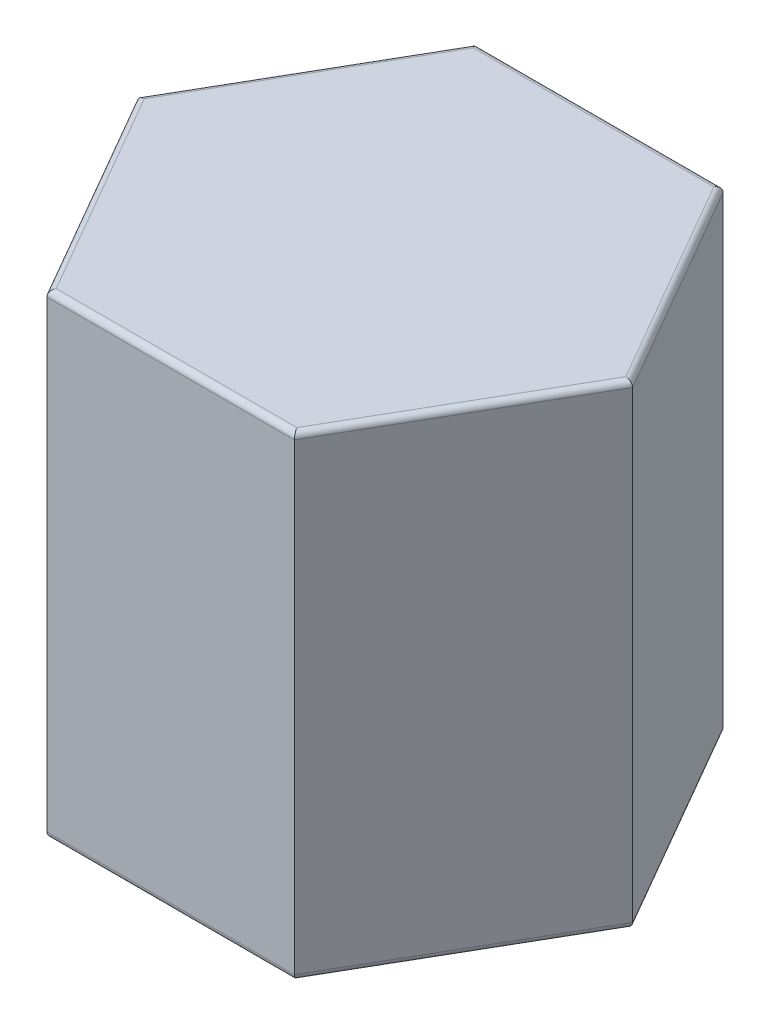
ISO-10303-21;
HEADER;
FILE_DESCRIPTION(('STEP AP214'),'2;1');
FILE_NAME('part.step','',(''),(''),'','','');
FILE_SCHEMA(('AUTOMOTIVE_DESIGN { 1 0 10303 214 1 1 1 1 }'));
ENDSEC;
DATA;
#1=APPLICATION_CONTEXT('core data for automotive mechanical design processes');
#2=APPLICATION_PROTOCOL_DEFINITION('international standard','automotive_design',2000,#1);
#3=PRODUCT_CONTEXT('',#1,'mechanical');
#4=PRODUCT('Part','Part','',(#3));
#5=PRODUCT_RELATED_PRODUCT_CATEGORY('part','',(#4));
#6=PRODUCT_DEFINITION_FORMATION('','',#4);
#7=PRODUCT_DEFINITION_CONTEXT('part definition',#1,'design');
#8=PRODUCT_DEFINITION('design','',#6,#7);
#9=PRODUCT_DEFINITION_SHAPE('','',#8);
#10=(LENGTH_UNIT() NAMED_UNIT(*) SI_UNIT(.MILLI.,.METRE.));
#11=(NAMED_UNIT(*) PLANE_ANGLE_UNIT() SI_UNIT($,.RADIAN.));
#12=(NAMED_UNIT(*) SI_UNIT($,.STERADIAN.) SOLID_ANGLE_UNIT());
#13=UNCERTAINTY_MEASURE_WITH_UNIT(LENGTH_MEASURE(1.E-05),#10,'distance_accuracy_value','');
#14=(GEOMETRIC_REPRESENTATION_CONTEXT(3) GLOBAL_UNCERTAINTY_ASSIGNED_CONTEXT((#13)) GLOBAL_UNIT_ASSIGNED_CONTEXT((#10,
#11,#12)) REPRESENTATION_CONTEXT('',''));
#15=CARTESIAN_POINT('',(0.,0.,0.));
#16=DIRECTION('',(0.,0.,1.));
#17=DIRECTION('',(1.,0.,0.));
#18=AXIS2_PLACEMENT_3D('',#15,#16,#17);
#19=CARTESIAN_POINT('',(20.846252377345,40.,0.00164959713498398));
#20=DIRECTION('',(-0.866025403784439,0.,-0.499999999999999));
#21=DIRECTION('',(-0.499999999999999,0.,0.866025403784439));
#22=AXIS2_PLACEMENT_3D('',#19,#20,#21);
#23=PLANE('',#22);
#24=DIRECTION('',(0.,-1.,0.));
#25=VECTOR('',#24,1.);
#26=CARTESIAN_POINT('',(10.4236026465347,40.,18.0542084803927));
#27=LINE('',#26,#25);
#28=CARTESIAN_POINT('',(10.4236026465347,39.5,18.0542084803927));
#29=VERTEX_POINT('',#28);
#30=CARTESIAN_POINT('',(10.4236026465347,0.5,18.0542084803927));
#31=VERTEX_POINT('',#30);
#32=EDGE_CURVE('E204',#29,#31,#27,.T.);
#33=ORIENTED_EDGE('',*,*,#32,.T.);
#34=DIRECTION('',(0.499999999999999,0.,-0.866025403784439));
#35=VECTOR('',#34,1.);
#36=CARTESIAN_POINT('',(20.846252377345,0.5,0.00164959713498414));
#37=LINE('',#36,#35);
#38=CARTESIAN_POINT('',(20.846252377345,0.5,0.00164959713498398));
#39=VERTEX_POINT('',#38);
#40=EDGE_CURVE('E154',#31,#39,#37,.T.);
#41=ORIENTED_EDGE('',*,*,#40,.T.);
#42=DIRECTION('',(0.,-1.,0.));
#43=VECTOR('',#42,1.);
#44=CARTESIAN_POINT('',(20.846252377345,40.,0.00164959713498398));
#45=LINE('',#44,#43);
#46=CARTESIAN_POINT('',(20.846252377345,39.5,0.00164959713498398));
#47=VERTEX_POINT('',#46);
#48=EDGE_CURVE('E138',#47,#39,#45,.T.);
#49=ORIENTED_EDGE('',*,*,#48,.F.);
#50=DIRECTION('',(0.499999999999999,0.,-0.866025403784439));
#51=VECTOR('',#50,1.);
#52=CARTESIAN_POINT('',(20.846252377345,39.5,0.00164959713498398));
#53=LINE('',#52,#51);
#54=EDGE_CURVE('E151',#47,#29,#53,.F.);
#55=ORIENTED_EDGE('',*,*,#54,.T.);
#56=EDGE_LOOP('',(#33,#41,#49,#55));
#57=FACE_BOUND('',#56,.T.);
#58=ADVANCED_FACE('F43',(#57),#23,.F.);
#59=CARTESIAN_POINT('',(10.4236026465346,40.,-18.0509092861226));
#60=DIRECTION('',(-0.866025403784438,0.,0.500000000000001));
#61=DIRECTION('',(0.500000000000001,0.,0.866025403784438));
#62=AXIS2_PLACEMENT_3D('',#59,#60,#61);
#63=PLANE('',#62);
#64=ORIENTED_EDGE('',*,*,#48,.T.);
#65=DIRECTION('',(-0.500000000000001,0.,-0.866025403784438));
#66=VECTOR('',#65,1.);
#67=CARTESIAN_POINT('',(10.4236026465346,0.5,-18.0509092861226));
#68=LINE('',#67,#66);
#69=CARTESIAN_POINT('',(10.4236026465346,0.5,-18.0509092861226));
#70=VERTEX_POINT('',#69);
#71=EDGE_CURVE('E144',#39,#70,#68,.T.);
#72=ORIENTED_EDGE('',*,*,#71,.T.);
#73=DIRECTION('',(0.,-1.,0.));
#74=VECTOR('',#73,1.);
#75=CARTESIAN_POINT('',(10.4236026465346,40.,-18.0509092861226));
#76=LINE('',#75,#74);
#77=CARTESIAN_POINT('',(10.4236026465346,39.5,-18.0509092861226));
#78=VERTEX_POINT('',#77);
#79=EDGE_CURVE('E140',#78,#70,#76,.T.);
#80=ORIENTED_EDGE('',*,*,#79,.F.);
#81=DIRECTION('',(-0.500000000000001,0.,-0.866025403784438));
#82=VECTOR('',#81,1.);
#83=CARTESIAN_POINT('',(10.4236026465346,39.5,-18.0509092861226));
#84=LINE('',#83,#82);
#85=EDGE_CURVE('E135',#78,#47,#84,.F.);
#86=ORIENTED_EDGE('',*,*,#85,.T.);
#87=EDGE_LOOP('',(#64,#72,#80,#86));
#88=FACE_BOUND('',#87,.T.);
#89=ADVANCED_FACE('F137',(#88),#63,.F.);
#90=CARTESIAN_POINT('',(-10.4216968150861,40.,-18.0509092861226));
#91=DIRECTION('',(0.,0.,1.));
#92=DIRECTION('',(1.,0.,0.));
#93=AXIS2_PLACEMENT_3D('',#90,#91,#92);
#94=PLANE('',#93);
#95=ORIENTED_EDGE('',*,*,#79,.T.);
#96=DIRECTION('',(-1.,0.,0.));
#97=VECTOR('',#96,1.);
#98=CARTESIAN_POINT('',(-10.4216968150861,0.5,-18.0509092861226));
#99=LINE('',#98,#97);
#100=CARTESIAN_POINT('',(-10.4216968150861,0.5,-18.0509092861226));
#101=VERTEX_POINT('',#100);
#102=EDGE_CURVE('E238',#70,#101,#99,.T.);
#103=ORIENTED_EDGE('',*,*,#102,.T.);
#104=DIRECTION('',(0.,-1.,0.));
#105=VECTOR('',#104,1.);
#106=CARTESIAN_POINT('',(-10.4216968150861,40.,-18.0509092861226));
#107=LINE('',#106,#105);
#108=CARTESIAN_POINT('',(-10.4216968150861,39.5,-18.0509092861226));
#109=VERTEX_POINT('',#108);
#110=EDGE_CURVE('E218',#109,#101,#107,.T.);
#111=ORIENTED_EDGE('',*,*,#110,.F.);
#112=DIRECTION('',(-1.,0.,0.));
#113=VECTOR('',#112,1.);
#114=CARTESIAN_POINT('',(-10.4216968150861,39.5,-18.0509092861226));
#115=LINE('',#114,#113);
#116=EDGE_CURVE('E236',#109,#78,#115,.F.);
#117=ORIENTED_EDGE('',*,*,#116,.T.);
#118=EDGE_LOOP('',(#95,#103,#111,#117));
#119=FACE_BOUND('',#118,.T.);
#120=ADVANCED_FACE('F295',(#119),#94,.F.);
#121=CARTESIAN_POINT('',(-20.8443465458965,40.,0.00164959713510541));
#122=DIRECTION('',(0.866025403784439,0.,0.499999999999998));
#123=DIRECTION('',(0.499999999999999,0.,-0.86602540378444));
#124=AXIS2_PLACEMENT_3D('',#121,#122,#123);
#125=PLANE('',#124);
#126=ORIENTED_EDGE('',*,*,#110,.T.);
#127=DIRECTION('',(-0.499999999999999,0.,0.86602540378444));
#128=VECTOR('',#127,1.);
#129=CARTESIAN_POINT('',(-20.8443465458965,0.5,0.00164959713510529));
#130=LINE('',#129,#128);
#131=CARTESIAN_POINT('',(-20.8443465458965,0.5,0.00164959713510541));
#132=VERTEX_POINT('',#131);
#133=EDGE_CURVE('E242',#101,#132,#130,.T.);
#134=ORIENTED_EDGE('',*,*,#133,.T.);
#135=DIRECTION('',(0.,-1.,0.));
#136=VECTOR('',#135,1.);
#137=CARTESIAN_POINT('',(-20.8443465458965,40.,0.00164959713510541));
#138=LINE('',#137,#136);
#139=CARTESIAN_POINT('',(-20.8443465458965,39.5,0.00164959713510541));
#140=VERTEX_POINT('',#139);
#141=EDGE_CURVE('E213',#140,#132,#138,.T.);
#142=ORIENTED_EDGE('',*,*,#141,.F.);
#143=DIRECTION('',(-0.499999999999999,0.,0.86602540378444));
#144=VECTOR('',#143,1.);
#145=CARTESIAN_POINT('',(-20.8443465458965,39.5,0.00164959713510541));
#146=LINE('',#145,#144);
#147=EDGE_CURVE('E240',#140,#109,#146,.F.);
#148=ORIENTED_EDGE('',*,*,#147,.T.);
#149=EDGE_LOOP('',(#126,#134,#142,#148));
#150=FACE_BOUND('',#149,.T.);
#151=ADVANCED_FACE('F300',(#150),#125,.F.);
#152=CARTESIAN_POINT('',(-10.4216968150861,40.,18.0542084803927));
#153=DIRECTION('',(0.866025403784438,0.,-0.500000000000002));
#154=DIRECTION('',(-0.500000000000002,0.,-0.866025403784438));
#155=AXIS2_PLACEMENT_3D('',#152,#153,#154);
#156=PLANE('',#155);
#157=ORIENTED_EDGE('',*,*,#141,.T.);
#158=DIRECTION('',(0.500000000000002,0.,0.866025403784438));
#159=VECTOR('',#158,1.);
#160=CARTESIAN_POINT('',(-10.4216968150861,0.5,18.0542084803927));
#161=LINE('',#160,#159);
#162=CARTESIAN_POINT('',(-10.4216968150861,0.5,18.0542084803927));
#163=VERTEX_POINT('',#162);
#164=EDGE_CURVE('E246',#132,#163,#161,.T.);
#165=ORIENTED_EDGE('',*,*,#164,.T.);
#166=DIRECTION('',(0.,-1.,0.));
#167=VECTOR('',#166,1.);
#168=CARTESIAN_POINT('',(-10.4216968150861,40.,18.0542084803927));
#169=LINE('',#168,#167);
#170=CARTESIAN_POINT('',(-10.4216968150861,39.5,18.0542084803927));
#171=VERTEX_POINT('',#170);
#172=EDGE_CURVE('E209',#171,#163,#169,.T.);
#173=ORIENTED_EDGE('',*,*,#172,.F.);
#174=DIRECTION('',(0.500000000000002,0.,0.866025403784438));
#175=VECTOR('',#174,1.);
#176=CARTESIAN_POINT('',(-10.4216968150861,39.5,18.0542084803927));
#177=LINE('',#176,#175);
#178=EDGE_CURVE('E244',#171,#140,#177,.F.);
#179=ORIENTED_EDGE('',*,*,#178,.T.);
#180=EDGE_LOOP('',(#157,#165,#173,#179));
#181=FACE_BOUND('',#180,.T.);
#182=ADVANCED_FACE('F273',(#181),#156,.F.);
#183=CARTESIAN_POINT('',(10.4236026465347,40.,18.0542084803927));
#184=DIRECTION('',(0.,0.,-1.));
#185=DIRECTION('',(-1.,0.,0.));
#186=AXIS2_PLACEMENT_3D('',#183,#184,#185);
#187=PLANE('',#186);
#188=ORIENTED_EDGE('',*,*,#172,.T.);
#189=DIRECTION('',(1.,0.,0.));
#190=VECTOR('',#189,1.);
#191=CARTESIAN_POINT('',(10.4236026465347,0.5,18.0542084803927));
#192=LINE('',#191,#190);
#193=EDGE_CURVE('E250',#163,#31,#192,.T.);
#194=ORIENTED_EDGE('',*,*,#193,.T.);
#195=ORIENTED_EDGE('',*,*,#32,.F.);
#196=DIRECTION('',(1.,0.,0.));
#197=VECTOR('',#196,1.);
#198=CARTESIAN_POINT('',(10.4236026465347,39.5,18.0542084803927));
#199=LINE('',#198,#197);
#200=EDGE_CURVE('E248',#29,#171,#199,.F.);
#201=ORIENTED_EDGE('',*,*,#200,.T.);
#202=EDGE_LOOP('',(#188,#194,#195,#201));
#203=FACE_BOUND('',#202,.T.);
#204=ADVANCED_FACE('F270',(#203),#187,.F.);
#205=CARTESIAN_POINT('',(0.,40.,0.));
#206=DIRECTION('',(0.,-1.,0.));
#207=DIRECTION('',(0.,0.,-1.));
#208=AXIS2_PLACEMENT_3D('',#205,#206,#207);
#209=PLANE('',#208);
#210=DIRECTION('',(1.,0.,0.));
#211=VECTOR('',#210,1.);
#212=CARTESIAN_POINT('',(0.,40.,17.5542084803927));
#213=LINE('',#212,#211);
#214=CARTESIAN_POINT('',(-10.1330216804913,40.,17.5542084803927));
#215=VERTEX_POINT('',#214);
#216=CARTESIAN_POINT('',(10.1349275119399,40.,17.5542084803927));
#217=VERTEX_POINT('',#216);
#218=EDGE_CURVE('E252',#215,#217,#213,.T.);
#219=ORIENTED_EDGE('',*,*,#218,.T.);
#220=DIRECTION('',(0.499999999999999,0.,-0.866025403784439));
#221=VECTOR('',#220,1.);
#222=CARTESIAN_POINT('',(15.202390877629,40.,8.777104465525));
#223=LINE('',#222,#221);
#224=CARTESIAN_POINT('',(20.2689021081554,40.,0.00164959713497996));
#225=VERTEX_POINT('',#224);
#226=EDGE_CURVE('E11',#217,#225,#223,.T.);
#227=ORIENTED_EDGE('',*,*,#226,.T.);
#228=DIRECTION('',(-0.500000000000001,0.,-0.866025403784438));
#229=VECTOR('',#228,1.);
#230=CARTESIAN_POINT('',(15.2009622846041,40.,-8.77627966695755));
#231=LINE('',#230,#229);
#232=CARTESIAN_POINT('',(10.1349275119398,40.,-17.5509092861226));
#233=VERTEX_POINT('',#232);
#234=EDGE_CURVE('E52',#225,#233,#231,.T.);
#235=ORIENTED_EDGE('',*,*,#234,.T.);
#236=DIRECTION('',(-1.,0.,0.));
#237=VECTOR('',#236,1.);
#238=CARTESIAN_POINT('',(0.,40.,-17.5509092861226));
#239=LINE('',#238,#237);
#240=CARTESIAN_POINT('',(-10.1330216804913,40.,-17.5509092861226));
#241=VERTEX_POINT('',#240);
#242=EDGE_CURVE('E258',#233,#241,#239,.T.);
#243=ORIENTED_EDGE('',*,*,#242,.T.);
#244=DIRECTION('',(-0.499999999999999,0.,0.86602540378444));
#245=VECTOR('',#244,1.);
#246=CARTESIAN_POINT('',(-15.1995329110177,40.,-8.77545441773258));
#247=LINE('',#246,#245);
#248=CARTESIAN_POINT('',(-20.2669962767068,40.,0.0016495971351095));
#249=VERTEX_POINT('',#248);
#250=EDGE_CURVE('E256',#241,#249,#247,.T.);
#251=ORIENTED_EDGE('',*,*,#250,.T.);
#252=DIRECTION('',(0.500000000000002,0.,0.866025403784438));
#253=VECTOR('',#252,1.);
#254=CARTESIAN_POINT('',(-15.2009615040426,40.,8.77627921630017));
#255=LINE('',#254,#253);
#256=EDGE_CURVE('E254',#249,#215,#255,.T.);
#257=ORIENTED_EDGE('',*,*,#256,.T.);
#258=EDGE_LOOP('',(#219,#227,#235,#243,#251,#257));
#259=FACE_BOUND('',#258,.T.);
#260=ADVANCED_FACE('F260',(#259),#209,.F.);
#261=CARTESIAN_POINT('',(0.,0.,0.));
#262=DIRECTION('',(0.,-1.,0.));
#263=DIRECTION('',(0.,0.,-1.));
#264=AXIS2_PLACEMENT_3D('',#261,#262,#263);
#265=PLANE('',#264);
#266=DIRECTION('',(-0.500000000000001,0.,-0.866025403784438));
#267=VECTOR('',#266,1.);
#268=CARTESIAN_POINT('',(20.4132396754528,0.,0.251649597134983));
#269=LINE('',#268,#267);
#270=CARTESIAN_POINT('',(10.1349275119398,0.,-17.5509092861226));
#271=VERTEX_POINT('',#270);
#272=CARTESIAN_POINT('',(20.2689021081554,0.,0.00164959713498256));
#273=VERTEX_POINT('',#272);
#274=EDGE_CURVE('E231',#271,#273,#269,.F.);
#275=ORIENTED_EDGE('',*,*,#274,.T.);
#276=DIRECTION('',(0.499999999999999,0.,-0.866025403784439));
#277=VECTOR('',#276,1.);
#278=CARTESIAN_POINT('',(9.99058994464245,0.,17.8042084803927));
#279=LINE('',#278,#277);
#280=CARTESIAN_POINT('',(10.1349275119399,0.,17.5542084803927));
#281=VERTEX_POINT('',#280);
#282=EDGE_CURVE('E145',#273,#281,#279,.F.);
#283=ORIENTED_EDGE('',*,*,#282,.T.);
#284=DIRECTION('',(1.,0.,0.));
#285=VECTOR('',#284,1.);
#286=CARTESIAN_POINT('',(-10.4216968150861,0.,17.5542084803927));
#287=LINE('',#286,#285);
#288=CARTESIAN_POINT('',(-10.1330216804913,0.,17.5542084803927));
#289=VERTEX_POINT('',#288);
#290=EDGE_CURVE('E223',#281,#289,#287,.F.);
#291=ORIENTED_EDGE('',*,*,#290,.T.);
#292=DIRECTION('',(0.500000000000002,0.,0.866025403784438));
#293=VECTOR('',#292,1.);
#294=CARTESIAN_POINT('',(-20.4113338440043,0.,-0.248350402864899));
#295=LINE('',#294,#293);
#296=CARTESIAN_POINT('',(-20.2669962767068,0.,0.00164959713510365));
#297=VERTEX_POINT('',#296);
#298=EDGE_CURVE('E225',#289,#297,#295,.F.);
#299=ORIENTED_EDGE('',*,*,#298,.T.);
#300=DIRECTION('',(-0.499999999999999,0.,0.86602540378444));
#301=VECTOR('',#300,1.);
#302=CARTESIAN_POINT('',(-9.98868411319389,0.,-17.8009092861226));
#303=LINE('',#302,#301);
#304=CARTESIAN_POINT('',(-10.1330216804913,0.,-17.5509092861226));
#305=VERTEX_POINT('',#304);
#306=EDGE_CURVE('E227',#297,#305,#303,.F.);
#307=ORIENTED_EDGE('',*,*,#306,.T.);
#308=DIRECTION('',(-1.,0.,0.));
#309=VECTOR('',#308,1.);
#310=CARTESIAN_POINT('',(10.4236026465346,0.,-17.5509092861226));
#311=LINE('',#310,#309);
#312=EDGE_CURVE('E229',#305,#271,#311,.F.);
#313=ORIENTED_EDGE('',*,*,#312,.T.);
#314=EDGE_LOOP('',(#275,#283,#291,#299,#307,#313));
#315=FACE_BOUND('',#314,.T.);
#316=ADVANCED_FACE('F309',(#315),#265,.T.);
#317=CARTESIAN_POINT('',(-20.4113338440042,0.5,0.251649597135105));
#318=DIRECTION('',(0.499999999999999,0.,-0.86602540378444));
#319=DIRECTION('',(-0.866025403784439,0.,-0.499999999999998));
#320=AXIS2_PLACEMENT_3D('',#317,#318,#319);
#321=CYLINDRICAL_SURFACE('',#320,0.5);
#322=CARTESIAN_POINT('',(-10.1330216804913,0.5,-17.5509092861226));
#323=DIRECTION('',(0.866025403784438,0.,-0.500000000000002));
#324=DIRECTION('',(-0.500000000000002,0.,-0.866025403784438));
#325=AXIS2_PLACEMENT_3D('',#322,#323,#324);
#326=ELLIPSE('',#325,0.577350269189626,0.5);
#327=EDGE_CURVE('E197',#305,#101,#326,.T.);
#328=ORIENTED_EDGE('',*,*,#327,.F.);
#329=ORIENTED_EDGE('',*,*,#306,.F.);
#330=CARTESIAN_POINT('',(-20.2669962767068,0.5,0.0016495971351094));
#331=DIRECTION('',(0.,0.,-1.));
#332=DIRECTION('',(-1.,0.,0.));
#333=AXIS2_PLACEMENT_3D('',#330,#331,#332);
#334=ELLIPSE('',#333,0.577350269189626,0.5);
#335=EDGE_CURVE('E166',#132,#297,#334,.F.);
#336=ORIENTED_EDGE('',*,*,#335,.F.);
#337=ORIENTED_EDGE('',*,*,#133,.F.);
#338=EDGE_LOOP('',(#328,#329,#336,#337));
#339=FACE_BOUND('',#338,.T.);
#340=ADVANCED_FACE('F312',(#339),#321,.T.);
#341=CARTESIAN_POINT('',(-9.98868411319385,0.5,17.8042084803927));
#342=DIRECTION('',(-0.500000000000002,0.,-0.866025403784438));
#343=DIRECTION('',(-0.866025403784438,0.,0.500000000000002));
#344=AXIS2_PLACEMENT_3D('',#341,#342,#343);
#345=CYLINDRICAL_SURFACE('',#344,0.5);
#346=ORIENTED_EDGE('',*,*,#335,.T.);
#347=ORIENTED_EDGE('',*,*,#298,.F.);
#348=CARTESIAN_POINT('',(-10.1330216804913,0.5,17.5542084803927));
#349=DIRECTION('',(-0.866025403784439,0.,-0.499999999999999));
#350=DIRECTION('',(-0.499999999999999,0.,0.86602540378444));
#351=AXIS2_PLACEMENT_3D('',#348,#349,#350);
#352=ELLIPSE('',#351,0.577350269189626,0.5);
#353=EDGE_CURVE('E195',#163,#289,#352,.F.);
#354=ORIENTED_EDGE('',*,*,#353,.F.);
#355=ORIENTED_EDGE('',*,*,#164,.F.);
#356=EDGE_LOOP('',(#346,#347,#354,#355));
#357=FACE_BOUND('',#356,.T.);
#358=ADVANCED_FACE('F275',(#357),#345,.T.);
#359=CARTESIAN_POINT('',(-10.4216968150861,0.5,-17.5509092861226));
#360=DIRECTION('',(1.,0.,0.));
#361=DIRECTION('',(0.,0.,-1.));
#362=AXIS2_PLACEMENT_3D('',#359,#360,#361);
#363=CYLINDRICAL_SURFACE('',#362,0.5);
#364=ORIENTED_EDGE('',*,*,#327,.T.);
#365=ORIENTED_EDGE('',*,*,#102,.F.);
#366=CARTESIAN_POINT('',(10.1349275119398,0.5,-17.5509092861226));
#367=DIRECTION('',(0.866025403784439,0.,0.499999999999998));
#368=DIRECTION('',(0.499999999999998,0.,-0.86602540378444));
#369=AXIS2_PLACEMENT_3D('',#366,#367,#368);
#370=ELLIPSE('',#369,0.577350269189626,0.5);
#371=EDGE_CURVE('E189',#271,#70,#370,.T.);
#372=ORIENTED_EDGE('',*,*,#371,.F.);
#373=ORIENTED_EDGE('',*,*,#312,.F.);
#374=EDGE_LOOP('',(#364,#365,#372,#373));
#375=FACE_BOUND('',#374,.T.);
#376=ADVANCED_FACE('F339',(#375),#363,.T.);
#377=CARTESIAN_POINT('',(10.4236026465347,0.5,17.5542084803927));
#378=DIRECTION('',(-1.,0.,0.));
#379=DIRECTION('',(0.,0.,1.));
#380=AXIS2_PLACEMENT_3D('',#377,#378,#379);
#381=CYLINDRICAL_SURFACE('',#380,0.5);
#382=ORIENTED_EDGE('',*,*,#353,.T.);
#383=ORIENTED_EDGE('',*,*,#290,.F.);
#384=CARTESIAN_POINT('',(10.1349275119399,0.5,17.5542084803927));
#385=DIRECTION('',(-0.866025403784438,0.,0.500000000000001));
#386=DIRECTION('',(-0.500000000000001,0.,-0.866025403784438));
#387=AXIS2_PLACEMENT_3D('',#384,#385,#386);
#388=ELLIPSE('',#387,0.577350269189626,0.5);
#389=EDGE_CURVE('E183',#31,#281,#388,.F.);
#390=ORIENTED_EDGE('',*,*,#389,.F.);
#391=ORIENTED_EDGE('',*,*,#193,.F.);
#392=EDGE_LOOP('',(#382,#383,#390,#391));
#393=FACE_BOUND('',#392,.T.);
#394=ADVANCED_FACE('F279',(#393),#381,.T.);
#395=CARTESIAN_POINT('',(9.99058994464243,0.5,-17.8009092861226));
#396=DIRECTION('',(0.500000000000001,0.,0.866025403784438));
#397=DIRECTION('',(0.866025403784438,0.,-0.500000000000001));
#398=AXIS2_PLACEMENT_3D('',#395,#396,#397);
#399=CYLINDRICAL_SURFACE('',#398,0.5);
#400=ORIENTED_EDGE('',*,*,#371,.T.);
#401=ORIENTED_EDGE('',*,*,#71,.F.);
#402=CARTESIAN_POINT('',(20.2689021081554,0.5,0.00164959713498013));
#403=DIRECTION('',(0.,0.,1.));
#404=DIRECTION('',(1.,0.,0.));
#405=AXIS2_PLACEMENT_3D('',#402,#403,#404);
#406=ELLIPSE('',#405,0.577350269189626,0.5);
#407=EDGE_CURVE('E178',#273,#39,#406,.T.);
#408=ORIENTED_EDGE('',*,*,#407,.F.);
#409=ORIENTED_EDGE('',*,*,#274,.F.);
#410=EDGE_LOOP('',(#400,#401,#408,#409));
#411=FACE_BOUND('',#410,.T.);
#412=ADVANCED_FACE('F282',(#411),#399,.T.);
#413=CARTESIAN_POINT('',(20.4132396754528,0.5,-0.248350402865015));
#414=DIRECTION('',(-0.499999999999999,0.,0.866025403784439));
#415=DIRECTION('',(0.866025403784439,0.,0.499999999999999));
#416=AXIS2_PLACEMENT_3D('',#413,#414,#415);
#417=CYLINDRICAL_SURFACE('',#416,0.5);
#418=ORIENTED_EDGE('',*,*,#389,.T.);
#419=ORIENTED_EDGE('',*,*,#282,.F.);
#420=ORIENTED_EDGE('',*,*,#407,.T.);
#421=ORIENTED_EDGE('',*,*,#40,.F.);
#422=EDGE_LOOP('',(#418,#419,#420,#421));
#423=FACE_BOUND('',#422,.T.);
#424=ADVANCED_FACE('F280',(#423),#417,.T.);
#425=CARTESIAN_POINT('',(-15.1995329110177,39.5,-8.77545441773258));
#426=DIRECTION('',(-0.499999999999999,0.,0.86602540378444));
#427=DIRECTION('',(0.866025403784439,0.,0.499999999999998));
#428=AXIS2_PLACEMENT_3D('',#425,#426,#427);
#429=CYLINDRICAL_SURFACE('',#428,0.5);
#430=CARTESIAN_POINT('',(-10.1330216804913,39.5,-17.5509092861226));
#431=DIRECTION('',(-0.866025403784438,0.,0.500000000000002));
#432=DIRECTION('',(0.500000000000002,0.,0.866025403784438));
#433=AXIS2_PLACEMENT_3D('',#430,#431,#432);
#434=ELLIPSE('',#433,0.577350269189626,0.5);
#435=EDGE_CURVE('E172',#109,#241,#434,.F.);
#436=ORIENTED_EDGE('',*,*,#435,.F.);
#437=ORIENTED_EDGE('',*,*,#147,.F.);
#438=CARTESIAN_POINT('',(-20.2669962767068,39.5,0.00164959713511766));
#439=DIRECTION('',(0.,0.,1.));
#440=DIRECTION('',(1.,0.,0.));
#441=AXIS2_PLACEMENT_3D('',#438,#439,#440);
#442=ELLIPSE('',#441,0.577350269189626,0.5);
#443=EDGE_CURVE('E47',#249,#140,#442,.T.);
#444=ORIENTED_EDGE('',*,*,#443,.F.);
#445=ORIENTED_EDGE('',*,*,#250,.F.);
#446=EDGE_LOOP('',(#436,#437,#444,#445));
#447=FACE_BOUND('',#446,.T.);
#448=ADVANCED_FACE('F45',(#447),#429,.T.);
#449=CARTESIAN_POINT('',(-15.2009615040426,39.5,8.77627921630017));
#450=DIRECTION('',(0.500000000000002,0.,0.866025403784438));
#451=DIRECTION('',(0.866025403784438,0.,-0.500000000000002));
#452=AXIS2_PLACEMENT_3D('',#449,#450,#451);
#453=CYLINDRICAL_SURFACE('',#452,0.5);
#454=ORIENTED_EDGE('',*,*,#443,.T.);
#455=ORIENTED_EDGE('',*,*,#178,.F.);
#456=CARTESIAN_POINT('',(-10.1330216804913,39.5,17.5542084803927));
#457=DIRECTION('',(0.866025403784439,0.,0.499999999999999));
#458=DIRECTION('',(0.499999999999999,0.,-0.86602540378444));
#459=AXIS2_PLACEMENT_3D('',#456,#457,#458);
#460=ELLIPSE('',#459,0.577350269189626,0.5);
#461=EDGE_CURVE('E170',#215,#171,#460,.T.);
#462=ORIENTED_EDGE('',*,*,#461,.F.);
#463=ORIENTED_EDGE('',*,*,#256,.F.);
#464=EDGE_LOOP('',(#454,#455,#462,#463));
#465=FACE_BOUND('',#464,.T.);
#466=ADVANCED_FACE('F264',(#465),#453,.T.);
#467=CARTESIAN_POINT('',(0.,39.5,-17.5509092861226));
#468=DIRECTION('',(-1.,0.,0.));
#469=DIRECTION('',(0.,0.,1.));
#470=AXIS2_PLACEMENT_3D('',#467,#468,#469);
#471=CYLINDRICAL_SURFACE('',#470,0.5);
#472=ORIENTED_EDGE('',*,*,#435,.T.);
#473=ORIENTED_EDGE('',*,*,#242,.F.);
#474=CARTESIAN_POINT('',(10.1349275119398,39.5,-17.5509092861226));
#475=DIRECTION('',(-0.866025403784439,0.,-0.499999999999998));
#476=DIRECTION('',(-0.499999999999998,0.,0.86602540378444));
#477=AXIS2_PLACEMENT_3D('',#474,#475,#476);
#478=ELLIPSE('',#477,0.577350269189626,0.5);
#479=EDGE_CURVE('E163',#78,#233,#478,.F.);
#480=ORIENTED_EDGE('',*,*,#479,.F.);
#481=ORIENTED_EDGE('',*,*,#116,.F.);
#482=EDGE_LOOP('',(#472,#473,#480,#481));
#483=FACE_BOUND('',#482,.T.);
#484=ADVANCED_FACE('F379',(#483),#471,.T.);
#485=CARTESIAN_POINT('',(0.,39.5,17.5542084803927));
#486=DIRECTION('',(1.,0.,0.));
#487=DIRECTION('',(0.,0.,-1.));
#488=AXIS2_PLACEMENT_3D('',#485,#486,#487);
#489=CYLINDRICAL_SURFACE('',#488,0.5);
#490=ORIENTED_EDGE('',*,*,#461,.T.);
#491=ORIENTED_EDGE('',*,*,#200,.F.);
#492=CARTESIAN_POINT('',(10.1349275119399,39.5,17.5542084803927));
#493=DIRECTION('',(0.866025403784438,0.,-0.500000000000001));
#494=DIRECTION('',(0.500000000000001,0.,0.866025403784438));
#495=AXIS2_PLACEMENT_3D('',#492,#493,#494);
#496=ELLIPSE('',#495,0.577350269189626,0.5);
#497=EDGE_CURVE('E158',#217,#29,#496,.T.);
#498=ORIENTED_EDGE('',*,*,#497,.F.);
#499=ORIENTED_EDGE('',*,*,#218,.F.);
#500=EDGE_LOOP('',(#490,#491,#498,#499));
#501=FACE_BOUND('',#500,.T.);
#502=ADVANCED_FACE('F267',(#501),#489,.T.);
#503=CARTESIAN_POINT('',(15.2009622846041,39.5,-8.77627966695754));
#504=DIRECTION('',(-0.500000000000001,0.,-0.866025403784438));
#505=DIRECTION('',(-0.866025403784438,0.,0.500000000000001));
#506=AXIS2_PLACEMENT_3D('',#503,#504,#505);
#507=CYLINDRICAL_SURFACE('',#506,0.5);
#508=ORIENTED_EDGE('',*,*,#479,.T.);
#509=ORIENTED_EDGE('',*,*,#234,.F.);
#510=CARTESIAN_POINT('',(20.2689021081554,39.5,0.00164959713498322));
#511=DIRECTION('',(0.,0.,-1.));
#512=DIRECTION('',(-1.,0.,0.));
#513=AXIS2_PLACEMENT_3D('',#510,#511,#512);
#514=ELLIPSE('',#513,0.577350269189626,0.5);
#515=EDGE_CURVE('E60',#47,#225,#514,.F.);
#516=ORIENTED_EDGE('',*,*,#515,.F.);
#517=ORIENTED_EDGE('',*,*,#85,.F.);
#518=EDGE_LOOP('',(#508,#509,#516,#517));
#519=FACE_BOUND('',#518,.T.);
#520=ADVANCED_FACE('F161',(#519),#507,.T.);
#521=CARTESIAN_POINT('',(15.202390877629,39.5,8.777104465525));
#522=DIRECTION('',(0.499999999999999,0.,-0.866025403784439));
#523=DIRECTION('',(-0.866025403784439,0.,-0.499999999999999));
#524=AXIS2_PLACEMENT_3D('',#521,#522,#523);
#525=CYLINDRICAL_SURFACE('',#524,0.5);
#526=ORIENTED_EDGE('',*,*,#497,.T.);
#527=ORIENTED_EDGE('',*,*,#54,.F.);
#528=ORIENTED_EDGE('',*,*,#515,.T.);
#529=ORIENTED_EDGE('',*,*,#226,.F.);
#530=EDGE_LOOP('',(#526,#527,#528,#529));
#531=FACE_BOUND('',#530,.T.);
#532=ADVANCED_FACE('F156',(#531),#525,.T.);
#533=CLOSED_SHELL('',(#58,#89,#120,#151,#182,#204,#260,#316,#340,#358,#376,#394,#412,#424,#448,
#466,#484,#502,#520,#532));
#534=MANIFOLD_SOLID_BREP('B2',#533);
#535=ADVANCED_BREP_SHAPE_REPRESENTATION('',(#18,#534),#14);
#536=SHAPE_DEFINITION_REPRESENTATION(#9,#535);
ENDSEC;
END-ISO-10303-21;
